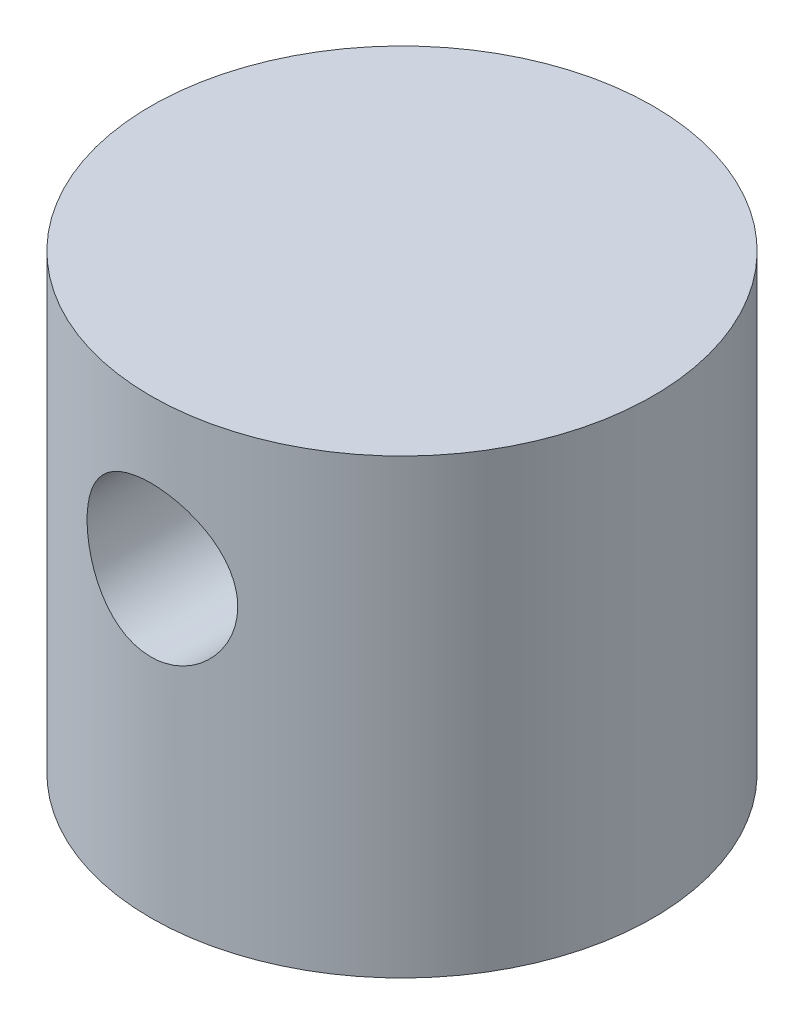
ISO-10303-21;
HEADER;
FILE_DESCRIPTION(('STEP AP214'),'2;1');
FILE_NAME('part.step','',(''),(''),'','','');
FILE_SCHEMA(('AUTOMOTIVE_DESIGN { 1 0 10303 214 1 1 1 1 }'));
ENDSEC;
DATA;
#1=APPLICATION_CONTEXT('core data for automotive mechanical design processes');
#2=APPLICATION_PROTOCOL_DEFINITION('international standard','automotive_design',2000,#1);
#3=PRODUCT_CONTEXT('',#1,'mechanical');
#4=PRODUCT('Part','Part','',(#3));
#5=PRODUCT_RELATED_PRODUCT_CATEGORY('part','',(#4));
#6=PRODUCT_DEFINITION_FORMATION('','',#4);
#7=PRODUCT_DEFINITION_CONTEXT('part definition',#1,'design');
#8=PRODUCT_DEFINITION('design','',#6,#7);
#9=PRODUCT_DEFINITION_SHAPE('','',#8);
#10=(LENGTH_UNIT() NAMED_UNIT(*) SI_UNIT(.MILLI.,.METRE.));
#11=(NAMED_UNIT(*) PLANE_ANGLE_UNIT() SI_UNIT($,.RADIAN.));
#12=(NAMED_UNIT(*) SI_UNIT($,.STERADIAN.) SOLID_ANGLE_UNIT());
#13=UNCERTAINTY_MEASURE_WITH_UNIT(LENGTH_MEASURE(1.E-05),#10,'distance_accuracy_value','');
#14=(GEOMETRIC_REPRESENTATION_CONTEXT(3) GLOBAL_UNCERTAINTY_ASSIGNED_CONTEXT((#13)) GLOBAL_UNIT_ASSIGNED_CONTEXT((#10,
#11,#12)) REPRESENTATION_CONTEXT('',''));
#15=CARTESIAN_POINT('',(0.,0.,0.));
#16=DIRECTION('',(0.,0.,1.));
#17=DIRECTION('',(1.,0.,0.));
#18=AXIS2_PLACEMENT_3D('',#15,#16,#17);
#19=CARTESIAN_POINT('',(0.,22.86,0.));
#20=DIRECTION('',(0.,-1.,0.));
#21=DIRECTION('',(0.,0.,-1.));
#22=AXIS2_PLACEMENT_3D('',#19,#20,#21);
#23=CYLINDRICAL_SURFACE('',#22,12.7);
#24=CARTESIAN_POINT('',(0.,19.05,-12.7));
#25=CARTESIAN_POINT('',(-0.209013076393382,19.0499974663884,-12.699998202964));
#26=CARTESIAN_POINT('',(-0.418051788612885,19.0327435863951,-12.6947908586264));
#27=CARTESIAN_POINT('',(-0.830041838274397,18.9643477602759,-12.6745264820798));
#28=CARTESIAN_POINT('',(-1.03299134120501,18.9131957066207,-12.6594665120982));
#29=CARTESIAN_POINT('',(-1.4268010776965,18.7788651170479,-12.6211470335466));
#30=CARTESIAN_POINT('',(-1.61767866556425,18.6957338311679,-12.5978996263608));
#31=CARTESIAN_POINT('',(-1.98278541987495,18.4999983236382,-12.5456215746362));
#32=CARTESIAN_POINT('',(-2.15701236737296,18.3873901812156,-12.5165901608785));
#33=CARTESIAN_POINT('',(-2.48887436484671,18.1324910210194,-12.4549087246965));
#34=CARTESIAN_POINT('',(-2.64596390096063,17.9895077702498,-12.4221845448887));
#35=CARTESIAN_POINT('',(-2.93433299145242,17.6793925560281,-12.3572481889452));
#36=CARTESIAN_POINT('',(-3.065608202717,17.5122565372026,-12.3250360998023));
#37=CARTESIAN_POINT('',(-3.30149295818217,17.1539642872845,-12.2639864954418));
#38=CARTESIAN_POINT('',(-3.40543664916422,16.9623525090835,-12.2352411292624));
#39=CARTESIAN_POINT('',(-3.57940342727891,16.5633672942551,-12.1854879580084));
#40=CARTESIAN_POINT('',(-3.64943465996732,16.3559976564229,-12.1644782951581));
#41=CARTESIAN_POINT('',(-3.75162149553935,15.9375087240286,-12.1333481192962));
#42=CARTESIAN_POINT('',(-3.78478278436081,15.7266570305856,-12.1229391608432));
#43=CARTESIAN_POINT('',(-3.81542875761267,15.3021457832094,-12.1133308596441));
#44=CARTESIAN_POINT('',(-3.81292208613139,15.0884869221299,-12.1141288009185));
#45=CARTESIAN_POINT('',(-3.77309322087522,14.6726048721345,-12.1265884993216));
#46=CARTESIAN_POINT('',(-3.7370310136722,14.4702472840799,-12.1378570704182));
#47=CARTESIAN_POINT('',(-3.63315047884722,14.0745977428654,-12.1693522482071));
#48=CARTESIAN_POINT('',(-3.56532901719768,13.8813066864692,-12.1895797389617));
#49=CARTESIAN_POINT('',(-3.39892707700351,13.5061951118617,-12.2370274201043));
#50=CARTESIAN_POINT('',(-3.29993795013992,13.3245680067536,-12.2643396093452));
#51=CARTESIAN_POINT('',(-3.07429465375256,12.9800806640941,-12.3228350698016));
#52=CARTESIAN_POINT('',(-2.94763377966574,12.817224989289,-12.3540192783736));
#53=CARTESIAN_POINT('',(-2.66398478544488,12.5077570754645,-12.4183396869676));
#54=CARTESIAN_POINT('',(-2.50595106496611,12.3621071933646,-12.4515030194866));
#55=CARTESIAN_POINT('',(-2.16728867865747,12.0991528804768,-12.5148909992068));
#56=CARTESIAN_POINT('',(-1.98665859172665,11.9818502338274,-12.5451154613676));
#57=CARTESIAN_POINT('',(-1.60618179739072,11.7783357969396,-12.5994962657645));
#58=CARTESIAN_POINT('',(-1.40621448435979,11.6923375087254,-12.6236106091752));
#59=CARTESIAN_POINT('',(-0.993763355632937,11.5554770411469,-12.6627514545384));
#60=CARTESIAN_POINT('',(-0.781283049037535,11.5046050615275,-12.6777804911498));
#61=CARTESIAN_POINT('',(-0.358018696377561,11.4410434681355,-12.6966564619459));
#62=CARTESIAN_POINT('',(-0.147447247907014,11.4270495720639,-12.7008852006119));
#63=CARTESIAN_POINT('',(0.273048998791394,11.4339856555087,-12.6988042503407));
#64=CARTESIAN_POINT('',(0.482973879594584,11.4549109729147,-12.692495968215));
#65=CARTESIAN_POINT('',(0.891295157486631,11.5300369122232,-12.6702997034739));
#66=CARTESIAN_POINT('',(1.08984484243999,11.5834754044554,-12.6546312769051));
#67=CARTESIAN_POINT('',(1.47511678294449,11.7211938112566,-12.615528435175));
#68=CARTESIAN_POINT('',(1.66183761364498,11.8054774330362,-12.5920930865558));
#69=CARTESIAN_POINT('',(2.02295046123107,12.0046830403221,-12.5392092205234));
#70=CARTESIAN_POINT('',(2.19695731854716,12.1202687260079,-12.5096341330729));
#71=CARTESIAN_POINT('',(2.52354920226958,12.3779908752941,-12.4478661066146));
#72=CARTESIAN_POINT('',(2.67612884218409,12.5201339941946,-12.4156725125527));
#73=CARTESIAN_POINT('',(2.96127791159606,12.8330637632582,-12.3508305654727));
#74=CARTESIAN_POINT('',(3.09291942328012,13.0047031644604,-12.318208155832));
#75=CARTESIAN_POINT('',(3.32559647483277,13.3683449650941,-12.25744348707));
#76=CARTESIAN_POINT('',(3.42663281726885,13.560346830377,-12.2293011104766));
#77=CARTESIAN_POINT('',(3.59454061702981,13.9586525277878,-12.1810066161741));
#78=CARTESIAN_POINT('',(3.66157121220007,14.1648845138061,-12.1608173810535));
#79=CARTESIAN_POINT('',(3.75975196270489,14.5864274410828,-12.1308264969947));
#80=CARTESIAN_POINT('',(3.79091441406468,14.8017352447889,-12.1210212883812));
#81=CARTESIAN_POINT('',(3.81563840591811,15.2256782567066,-12.1132593007578));
#82=CARTESIAN_POINT('',(3.81071260482176,15.4342176736655,-12.114825842695));
#83=CARTESIAN_POINT('',(3.76701063828535,15.8473498226376,-12.1284847903808));
#84=CARTESIAN_POINT('',(3.72823582836748,16.0519427123585,-12.140576774626));
#85=CARTESIAN_POINT('',(3.61891297563031,16.4489013137945,-12.1736043978434));
#86=CARTESIAN_POINT('',(3.54876545788095,16.6413873098911,-12.1944283556327));
#87=CARTESIAN_POINT('',(3.37900028087527,17.0120117946046,-12.2425530841269));
#88=CARTESIAN_POINT('',(3.27937698105667,17.1901475288096,-12.2698550942905));
#89=CARTESIAN_POINT('',(3.04923860064923,17.5340343159767,-12.3291009812628));
#90=CARTESIAN_POINT('',(2.91773041276215,17.6990978536009,-12.361177720173));
#91=CARTESIAN_POINT('',(2.62934283959635,18.0053043457025,-12.4257135394181));
#92=CARTESIAN_POINT('',(2.4724568715216,18.1464410742483,-12.4581727169238));
#93=CARTESIAN_POINT('',(2.13224303594548,18.4048994672292,-12.520953788898));
#94=CARTESIAN_POINT('',(1.94827622990815,18.5214042750129,-12.5511854580491));
#95=CARTESIAN_POINT('',(1.56245908991815,18.7216673315563,-12.6050212835767));
#96=CARTESIAN_POINT('',(1.36061717461734,18.8054408962173,-12.6286285382489));
#97=CARTESIAN_POINT('',(0.967124590144414,18.930354000158,-12.6644952442205));
#98=CARTESIAN_POINT('',(0.776698883363754,18.9750996491234,-12.6776994954792));
#99=CARTESIAN_POINT('',(0.390855695886179,19.0349213541136,-12.6954519901601));
#100=CARTESIAN_POINT('',(0.195439055039674,19.0500023690702,-12.7000016803304));
#101=CARTESIAN_POINT('',(0.,19.05,-12.7));
#102=B_SPLINE_CURVE_WITH_KNOTS('',3,(#24,#25,#26,#27,#28,#29,#30,#31,#32,#33,#34,#35,#36,#37,
#38,#39,#40,#41,#42,#43,#44,#45,#46,#47,#48,#49,#50,#51,#52,#53,#54,#55,#56,#57,#58,#59,#60,#61,
#62,#63,#64,#65,#66,#67,#68,#69,#70,#71,#72,#73,#74,#75,#76,#77,#78,#79,#80,#81,#82,#83,#84,#85,
#86,#87,#88,#89,#90,#91,#92,#93,#94,#95,#96,#97,#98,#99,#100,#101),.UNSPECIFIED.,.T.,.F.,(4,2,2,
2,2,2,2,2,2,2,2,2,2,2,2,2,2,2,2,2,2,2,2,2,2,2,2,2,2,2,2,2,2,2,2,2,2,2,4),(0.,0.626321337176031,
1.25282951070884,1.87841553780422,2.50408481760826,3.14593231488407,3.78788770713128,
4.44427561750437,5.10050578939788,5.73836010965761,6.37605984930487,6.99074082412097,
7.60548246891323,8.22864563175683,8.8519599480273,9.50130444282343,10.1506897958892,
10.8044245907949,11.4579769196317,12.088083759739,12.7181064801783,13.3339013657311,
13.9497702866807,14.5798871648539,15.2101621628048,15.8633261681996,16.5164730440181,
17.1665344997618,17.8163730402912,18.4391339489195,19.0618699195205,19.6768730263449,
20.2919938979647,20.9295219123861,21.5672155625124,22.2235521024953,22.8795811546348,
23.4653249751495,24.0509708706172),.UNSPECIFIED.);
#103=CARTESIAN_POINT('',(0.,19.05,-12.7));
#104=VERTEX_POINT('',#103);
#105=EDGE_CURVE('E10',#104,#104,#102,.T.);
#106=ORIENTED_EDGE('',*,*,#105,.T.);
#107=EDGE_LOOP('',(#106));
#108=FACE_BOUND('',#107,.T.);
#109=CARTESIAN_POINT('',(3.81,15.24,12.1150278579952));
#110=CARTESIAN_POINT('',(3.80999739989923,15.0312258482242,12.1150300174878));
#111=CARTESIAN_POINT('',(3.79278154744585,14.8224259706736,12.1204835113164));
#112=CARTESIAN_POINT('',(3.72455044894699,14.410930666037,12.1416210888876));
#113=CARTESIAN_POINT('',(3.67352390956876,14.2082373022864,12.1573085909325));
#114=CARTESIAN_POINT('',(3.53955993305698,13.8149717901897,12.1969810031367));
#115=CARTESIAN_POINT('',(3.45667557061381,13.6243800927319,12.2209521062625));
#116=CARTESIAN_POINT('',(3.26152311671537,13.259760287652,12.2744720867078));
#117=CARTESIAN_POINT('',(3.14925062648113,13.0857346649415,12.3040217988418));
#118=CARTESIAN_POINT('',(2.89470475519733,12.7536793679335,12.3664182995186));
#119=CARTESIAN_POINT('',(2.75166346226549,12.5962514192164,12.3993353311156));
#120=CARTESIAN_POINT('',(2.44128604345218,12.3072196036408,12.4641574931936));
#121=CARTESIAN_POINT('',(2.27394679947122,12.1756190562573,12.4960624931617));
#122=CARTESIAN_POINT('',(1.91544305199598,11.9393647424234,12.5560636503165));
#123=CARTESIAN_POINT('',(1.72385741419297,11.8353245019153,12.5840673982971));
#124=CARTESIAN_POINT('',(1.32492659923816,11.6611723620314,12.6322946723854));
#125=CARTESIAN_POINT('',(1.1175848321053,11.5910531453621,12.6525198762532));
#126=CARTESIAN_POINT('',(0.699322585682311,11.4887247972301,12.6824142084912));
#127=CARTESIAN_POINT('',(0.48867415334266,11.4554885757621,12.6923687571812));
#128=CARTESIAN_POINT('',(0.0645714323232612,11.424621995398,12.7016053181343));
#129=CARTESIAN_POINT('',(-0.14888225760794,11.426984157919,12.7008895720356));
#130=CARTESIAN_POINT('',(-0.565330737764396,11.4665578860993,12.6890679369684));
#131=CARTESIAN_POINT('',(-0.768442119808976,11.502657192277,12.678293673213));
#132=CARTESIAN_POINT('',(-1.16557860214404,11.6068635934255,12.6479686616604));
#133=CARTESIAN_POINT('',(-1.35960312616013,11.6749727153946,12.628417358067));
#134=CARTESIAN_POINT('',(-1.73570220893214,11.8420185394829,12.5822766130667));
#135=CARTESIAN_POINT('',(-1.91761126432357,11.9413050551297,12.5556078497802));
#136=CARTESIAN_POINT('',(-2.26254227140962,12.1676105451684,12.4980608724691));
#137=CARTESIAN_POINT('',(-2.42555972817671,12.29463609893,12.4671816604299));
#138=CARTESIAN_POINT('',(-2.73471762308413,12.5785822869061,12.4031133823679));
#139=CARTESIAN_POINT('',(-2.87996523421289,12.7364665743245,12.3698811610455));
#140=CARTESIAN_POINT('',(-3.14217434911745,13.0746754454518,12.3058930892621));
#141=CARTESIAN_POINT('',(-3.25913304188664,13.2550022565299,12.2751374850994));
#142=CARTESIAN_POINT('',(-3.46237548150279,13.6353282518597,12.2193787407683));
#143=CARTESIAN_POINT('',(-3.54835432656109,13.8354994963542,12.1944335899828));
#144=CARTESIAN_POINT('',(-3.68511741703439,14.2484023093088,12.1538083690401));
#145=CARTESIAN_POINT('',(-3.73591314384958,14.4611297556545,12.1381252766173));
#146=CARTESIAN_POINT('',(-3.79919916518518,14.8846091963081,12.1184631787762));
#147=CARTESIAN_POINT('',(-3.81304663806225,15.0951392886988,12.114069718344));
#148=CARTESIAN_POINT('',(-3.80583305971491,15.5155211660169,12.1163382879101));
#149=CARTESIAN_POINT('',(-3.7847768950305,15.7253730417742,12.122998770347));
#150=CARTESIAN_POINT('',(-3.70956239478568,16.1327804800481,12.1462179873244));
#151=CARTESIAN_POINT('',(-3.65627822035485,16.3305138572299,12.1625150832981));
#152=CARTESIAN_POINT('',(-3.51913387479734,16.7142202946693,12.2029001872652));
#153=CARTESIAN_POINT('',(-3.435268982706,16.9001915339169,12.2269893981183));
#154=CARTESIAN_POINT('',(-3.2367695283912,17.2606143587434,12.2810482095876));
#155=CARTESIAN_POINT('',(-3.12136952998734,17.434622791304,12.3111582851735));
#156=CARTESIAN_POINT('',(-2.86398466064975,17.7613007896992,12.3735644234329));
#157=CARTESIAN_POINT('',(-2.72199342658637,17.9139652327365,12.4058610081419));
#158=CARTESIAN_POINT('',(-2.40907603653375,18.1995582307694,12.4704762921234));
#159=CARTESIAN_POINT('',(-2.23726010727789,18.3315244976269,12.5027498246003));
#160=CARTESIAN_POINT('',(-1.87315293285923,18.5647754206105,12.5624552344157));
#161=CARTESIAN_POINT('',(-1.68086270518162,18.6660616004449,12.5898873521718));
#162=CARTESIAN_POINT('',(-1.28253618195127,18.8341000776435,12.6366516500639));
#163=CARTESIAN_POINT('',(-1.07661613997612,18.9011103210438,12.6560441169941));
#164=CARTESIAN_POINT('',(-0.655751714921654,18.9993547339817,12.6848102817594));
#165=CARTESIAN_POINT('',(-0.440809932081091,19.030599139509,12.6941868460405));
#166=CARTESIAN_POINT('',(-0.016896470862179,19.0556465318984,12.7016902196674));
#167=CARTESIAN_POINT('',(0.191986354878928,19.0508450463359,12.7002363498271));
#168=CARTESIAN_POINT('',(0.605839482157618,19.0072730534522,12.6872305174124));
#169=CARTESIAN_POINT('',(0.810810004860308,18.9685044721595,12.6756791273954));
#170=CARTESIAN_POINT('',(1.20887696512492,18.8589623800451,12.6438956762999));
#171=CARTESIAN_POINT('',(1.40207727547206,18.7885370211521,12.6237581636761));
#172=CARTESIAN_POINT('',(1.77402042389068,18.6179919371511,12.5768847532079));
#173=CARTESIAN_POINT('',(1.95276087997023,18.5178673322707,12.5501477711507));
#174=CARTESIAN_POINT('',(2.29692680674642,18.2870514181302,12.4918207320142));
#175=CARTESIAN_POINT('',(2.46174323518812,18.1554845678074,12.460102763772));
#176=CARTESIAN_POINT('',(2.76742543122556,17.8670956136253,12.3957978452797));
#177=CARTESIAN_POINT('',(2.90828427641457,17.7102662357037,12.3632106470062));
#178=CARTESIAN_POINT('',(3.16626924259787,17.3701944231237,12.2997132877024));
#179=CARTESIAN_POINT('',(3.28256289775701,17.1863040745168,12.2688820571553));
#180=CARTESIAN_POINT('',(3.48244956353535,16.8006898577614,12.2136547054725));
#181=CARTESIAN_POINT('',(3.56605828713021,16.5989746160891,12.1892554940455));
#182=CARTESIAN_POINT('',(3.69066934035746,16.2058593036932,12.1520665449104));
#183=CARTESIAN_POINT('',(3.7352950188908,16.0156940367881,12.1383083330253));
#184=CARTESIAN_POINT('',(3.79495859840714,15.630359334868,12.1197888818919));
#185=CARTESIAN_POINT('',(3.8100024309333,15.4351909110031,12.1150258390033));
#186=CARTESIAN_POINT('',(3.81,15.24,12.1150278579952));
#187=B_SPLINE_CURVE_WITH_KNOTS('',3,(#109,#110,#111,#112,#113,#114,#115,#116,#117,#118,#119,
#120,#121,#122,#123,#124,#125,#126,#127,#128,#129,#130,#131,#132,#133,#134,#135,#136,#137,#138,
#139,#140,#141,#142,#143,#144,#145,#146,#147,#148,#149,#150,#151,#152,#153,#154,#155,#156,#157,
#158,#159,#160,#161,#162,#163,#164,#165,#166,#167,#168,#169,#170,#171,#172,#173,#174,#175,#176,
#177,#178,#179,#180,#181,#182,#183,#184,#185,#186),.UNSPECIFIED.,.T.,.F.,(4,2,2,2,2,2,2,2,2,2,2,
2,2,2,2,2,2,2,2,2,2,2,2,2,2,2,2,2,2,2,2,2,2,2,2,2,2,2,4),(0.,0.625602421425477,1.25141390989006,
1.87618729274413,2.50105424444005,3.14383801020278,3.78670433593032,4.44286485755057,
5.09888377193207,5.73613635979876,6.37325507417658,6.99008320016835,7.60695039161555,
8.23100231712617,8.85520242140709,9.50346453439125,10.1517910372933,10.8063344514857,
11.4606641660278,12.09060525214,12.7204581533938,13.3339483115121,13.9475332186292,
14.5775865880246,15.2077909186608,15.8617794550214,16.5157355061009,17.16469495215,
17.8134686230369,18.4372581194111,19.0610122474791,19.6780682606205,20.2952257161472,
20.9321305272502,21.5692190568654,22.2252956476763,22.881056446783,23.4660733080779,
24.0509728539512),.UNSPECIFIED.);
#188=CARTESIAN_POINT('',(3.81,15.24,12.1150278579952));
#189=VERTEX_POINT('',#188);
#190=EDGE_CURVE('E41',#189,#189,#187,.T.);
#191=ORIENTED_EDGE('',*,*,#190,.T.);
#192=EDGE_LOOP('',(#191));
#193=FACE_BOUND('',#192,.T.);
#194=CARTESIAN_POINT('',(0.,22.86,0.));
#195=DIRECTION('',(0.,1.,0.));
#196=DIRECTION('',(0.,0.,1.));
#197=AXIS2_PLACEMENT_3D('',#194,#195,#196);
#198=CIRCLE('',#197,12.7);
#199=CARTESIAN_POINT('',(0.,22.86,12.7));
#200=VERTEX_POINT('',#199);
#201=EDGE_CURVE('E45',#200,#200,#198,.T.);
#202=ORIENTED_EDGE('',*,*,#201,.F.);
#203=EDGE_LOOP('',(#202));
#204=FACE_BOUND('',#203,.T.);
#205=CARTESIAN_POINT('',(0.,0.,0.));
#206=DIRECTION('',(0.,1.,0.));
#207=DIRECTION('',(0.,0.,1.));
#208=AXIS2_PLACEMENT_3D('',#205,#206,#207);
#209=CIRCLE('',#208,12.7);
#210=CARTESIAN_POINT('',(0.,0.,12.7));
#211=VERTEX_POINT('',#210);
#212=EDGE_CURVE('E49',#211,#211,#209,.T.);
#213=ORIENTED_EDGE('',*,*,#212,.T.);
#214=EDGE_LOOP('',(#213));
#215=FACE_BOUND('',#214,.T.);
#216=ADVANCED_FACE('F31',(#108,#193,#204,#215),#23,.T.);
#217=CARTESIAN_POINT('',(0.,22.86,0.));
#218=DIRECTION('',(0.,1.,0.));
#219=DIRECTION('',(0.,0.,1.));
#220=AXIS2_PLACEMENT_3D('',#217,#218,#219);
#221=PLANE('',#220);
#222=ORIENTED_EDGE('',*,*,#201,.T.);
#223=EDGE_LOOP('',(#222));
#224=FACE_BOUND('',#223,.T.);
#225=ADVANCED_FACE('F60',(#224),#221,.T.);
#226=CARTESIAN_POINT('',(0.,0.,0.));
#227=DIRECTION('',(0.,1.,0.));
#228=DIRECTION('',(0.,0.,1.));
#229=AXIS2_PLACEMENT_3D('',#226,#227,#228);
#230=PLANE('',#229);
#231=ORIENTED_EDGE('',*,*,#212,.F.);
#232=EDGE_LOOP('',(#231));
#233=FACE_BOUND('',#232,.T.);
#234=ADVANCED_FACE('F58',(#233),#230,.F.);
#235=CARTESIAN_POINT('',(0.,15.24,-12.7));
#236=DIRECTION('',(0.,0.,1.));
#237=DIRECTION('',(1.,0.,0.));
#238=AXIS2_PLACEMENT_3D('',#235,#236,#237);
#239=CYLINDRICAL_SURFACE('',#238,3.81);
#240=ORIENTED_EDGE('',*,*,#190,.F.);
#241=EDGE_LOOP('',(#240));
#242=FACE_BOUND('',#241,.T.);
#243=ORIENTED_EDGE('',*,*,#105,.F.);
#244=EDGE_LOOP('',(#243));
#245=FACE_BOUND('',#244,.T.);
#246=ADVANCED_FACE('F54',(#242,#245),#239,.F.);
#247=CLOSED_SHELL('',(#216,#225,#234,#246));
#248=MANIFOLD_SOLID_BREP('B2',#247);
#249=ADVANCED_BREP_SHAPE_REPRESENTATION('',(#18,#248),#14);
#250=SHAPE_DEFINITION_REPRESENTATION(#9,#249);
ENDSEC;
END-ISO-10303-21;
